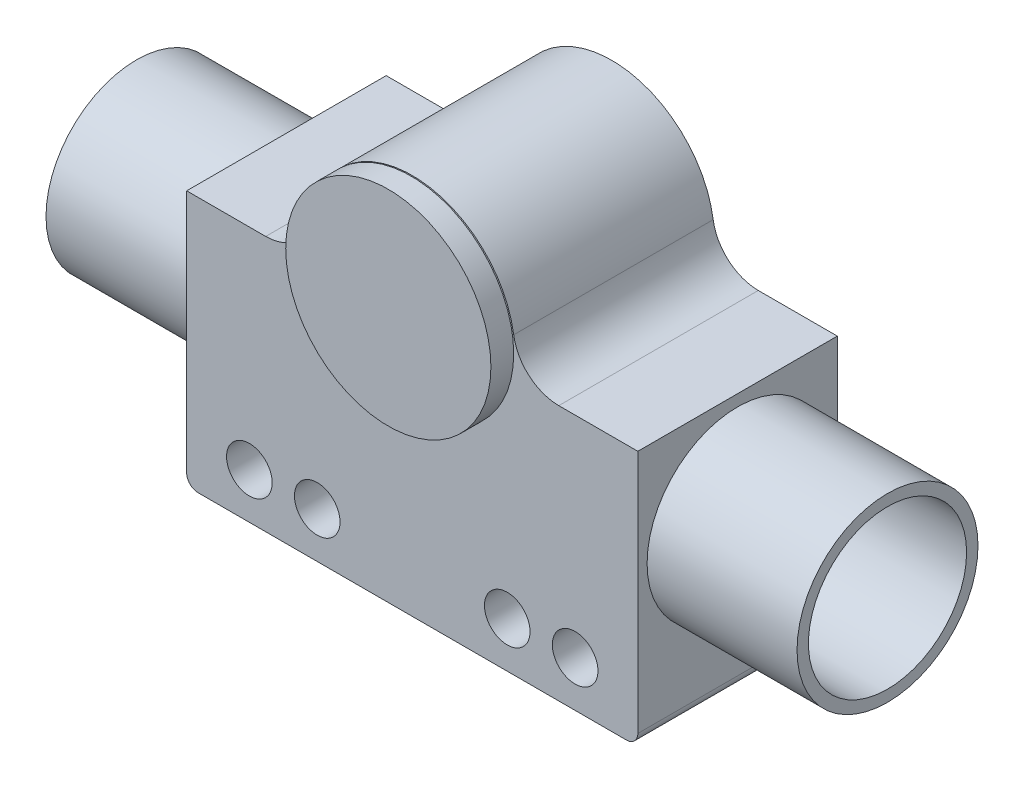
ISO-10303-21;
HEADER;
FILE_DESCRIPTION(('STEP AP214'),'2;1');
FILE_NAME('part.step','',(''),(''),'','','');
FILE_SCHEMA(('AUTOMOTIVE_DESIGN { 1 0 10303 214 1 1 1 1 }'));
ENDSEC;
DATA;
#1=APPLICATION_CONTEXT('core data for automotive mechanical design processes');
#2=APPLICATION_PROTOCOL_DEFINITION('international standard','automotive_design',2000,#1);
#3=PRODUCT_CONTEXT('',#1,'mechanical');
#4=PRODUCT('Part','Part','',(#3));
#5=PRODUCT_RELATED_PRODUCT_CATEGORY('part','',(#4));
#6=PRODUCT_DEFINITION_FORMATION('','',#4);
#7=PRODUCT_DEFINITION_CONTEXT('part definition',#1,'design');
#8=PRODUCT_DEFINITION('design','',#6,#7);
#9=PRODUCT_DEFINITION_SHAPE('','',#8);
#10=(LENGTH_UNIT() NAMED_UNIT(*) SI_UNIT(.MILLI.,.METRE.));
#11=(NAMED_UNIT(*) PLANE_ANGLE_UNIT() SI_UNIT($,.RADIAN.));
#12=(NAMED_UNIT(*) SI_UNIT($,.STERADIAN.) SOLID_ANGLE_UNIT());
#13=UNCERTAINTY_MEASURE_WITH_UNIT(LENGTH_MEASURE(1.E-05),#10,'distance_accuracy_value','');
#14=(GEOMETRIC_REPRESENTATION_CONTEXT(3) GLOBAL_UNCERTAINTY_ASSIGNED_CONTEXT((#13)) GLOBAL_UNIT_ASSIGNED_CONTEXT((#10,
#11,#12)) REPRESENTATION_CONTEXT('',''));
#15=CARTESIAN_POINT('',(0.,0.,0.));
#16=DIRECTION('',(0.,0.,1.));
#17=DIRECTION('',(1.,0.,0.));
#18=AXIS2_PLACEMENT_3D('',#15,#16,#17);
#19=CARTESIAN_POINT('',(-37.575,-27.,-17.5));
#20=DIRECTION('',(0.,0.,-1.));
#21=DIRECTION('',(-1.,0.,0.));
#22=AXIS2_PLACEMENT_3D('',#19,#20,#21);
#23=PLANE('',#22);
#24=CARTESIAN_POINT('',(0.,22.,-17.5));
#25=DIRECTION('',(0.,0.,-1.));
#26=DIRECTION('',(-1.,0.,0.));
#27=AXIS2_PLACEMENT_3D('',#24,#25,#26);
#28=CIRCLE('',#27,10.);
#29=CARTESIAN_POINT('',(-10.,22.,-17.5));
#30=VERTEX_POINT('',#29);
#31=EDGE_CURVE('E380',#30,#30,#28,.T.);
#32=ORIENTED_EDGE('',*,*,#31,.F.);
#33=EDGE_LOOP('',(#32));
#34=FACE_BOUND('',#33,.T.);
#35=CARTESIAN_POINT('',(-28.575,-19.,-17.5));
#36=DIRECTION('',(0.,0.,-1.));
#37=DIRECTION('',(-1.,0.,0.));
#38=AXIS2_PLACEMENT_3D('',#35,#36,#37);
#39=CIRCLE('',#38,4.);
#40=CARTESIAN_POINT('',(-32.575,-19.,-17.5));
#41=VERTEX_POINT('',#40);
#42=EDGE_CURVE('E12',#41,#41,#39,.T.);
#43=ORIENTED_EDGE('',*,*,#42,.F.);
#44=EDGE_LOOP('',(#43));
#45=FACE_BOUND('',#44,.T.);
#46=DIRECTION('',(1.,0.,0.));
#47=VECTOR('',#46,1.);
#48=CARTESIAN_POINT('',(0.,-27.,-17.5));
#49=LINE('',#48,#47);
#50=CARTESIAN_POINT('',(-37.575,-27.,-17.5));
#51=VERTEX_POINT('',#50);
#52=CARTESIAN_POINT('',(37.575,-27.,-17.5));
#53=VERTEX_POINT('',#52);
#54=EDGE_CURVE('E132',#51,#53,#49,.T.);
#55=ORIENTED_EDGE('',*,*,#54,.F.);
#56=CARTESIAN_POINT('',(-37.575,-25.,-17.5));
#57=DIRECTION('',(0.,0.,1.));
#58=DIRECTION('',(1.,0.,0.));
#59=AXIS2_PLACEMENT_3D('',#56,#57,#58);
#60=CIRCLE('',#59,2.);
#61=CARTESIAN_POINT('',(-39.575,-25.,-17.5));
#62=VERTEX_POINT('',#61);
#63=EDGE_CURVE('E128',#51,#62,#60,.F.);
#64=ORIENTED_EDGE('',*,*,#63,.T.);
#65=DIRECTION('',(0.,1.,0.));
#66=VECTOR('',#65,1.);
#67=CARTESIAN_POINT('',(-39.575,0.,-17.5));
#68=LINE('',#67,#66);
#69=CARTESIAN_POINT('',(-39.575,17.875,-17.5));
#70=VERTEX_POINT('',#69);
#71=EDGE_CURVE('E119',#62,#70,#68,.T.);
#72=ORIENTED_EDGE('',*,*,#71,.T.);
#73=DIRECTION('',(1.,0.,0.));
#74=VECTOR('',#73,1.);
#75=CARTESIAN_POINT('',(0.,17.875,-17.5));
#76=LINE('',#75,#74);
#77=CARTESIAN_POINT('',(-25.7096163915372,17.875,-17.5));
#78=VERTEX_POINT('',#77);
#79=EDGE_CURVE('E125',#70,#78,#76,.T.);
#80=ORIENTED_EDGE('',*,*,#79,.T.);
#81=CARTESIAN_POINT('',(-25.7096163915372,25.875,-17.5));
#82=DIRECTION('',(0.,0.,1.));
#83=DIRECTION('',(1.,0.,0.));
#84=AXIS2_PLACEMENT_3D('',#81,#82,#83);
#85=CIRCLE('',#84,8.);
#86=CARTESIAN_POINT('',(-17.7989651941412,24.6826923076923,-17.5));
#87=VERTEX_POINT('',#86);
#88=EDGE_CURVE('E146',#78,#87,#85,.T.);
#89=ORIENTED_EDGE('',*,*,#88,.T.);
#90=CARTESIAN_POINT('',(0.,22.,-17.5));
#91=DIRECTION('',(0.,0.,1.));
#92=DIRECTION('',(1.,0.,0.));
#93=AXIS2_PLACEMENT_3D('',#90,#91,#92);
#94=CIRCLE('',#93,18.);
#95=CARTESIAN_POINT('',(17.7989651941412,24.6826923076923,-17.5));
#96=VERTEX_POINT('',#95);
#97=EDGE_CURVE('E148',#96,#87,#94,.T.);
#98=ORIENTED_EDGE('',*,*,#97,.F.);
#99=CARTESIAN_POINT('',(25.7096163915372,25.875,-17.5));
#100=DIRECTION('',(0.,0.,1.));
#101=DIRECTION('',(1.,0.,0.));
#102=AXIS2_PLACEMENT_3D('',#99,#100,#101);
#103=CIRCLE('',#102,8.);
#104=CARTESIAN_POINT('',(25.7096163915372,17.875,-17.5));
#105=VERTEX_POINT('',#104);
#106=EDGE_CURVE('E105',#105,#96,#103,.F.);
#107=ORIENTED_EDGE('',*,*,#106,.F.);
#108=DIRECTION('',(-1.,0.,0.));
#109=VECTOR('',#108,1.);
#110=CARTESIAN_POINT('',(0.,17.875,-17.5));
#111=LINE('',#110,#109);
#112=CARTESIAN_POINT('',(39.575,17.875,-17.5));
#113=VERTEX_POINT('',#112);
#114=EDGE_CURVE('E300',#113,#105,#111,.T.);
#115=ORIENTED_EDGE('',*,*,#114,.F.);
#116=DIRECTION('',(0.,1.,0.));
#117=VECTOR('',#116,1.);
#118=CARTESIAN_POINT('',(39.575,0.,-17.5));
#119=LINE('',#118,#117);
#120=CARTESIAN_POINT('',(39.575,-25.,-17.5));
#121=VERTEX_POINT('',#120);
#122=EDGE_CURVE('E302',#121,#113,#119,.T.);
#123=ORIENTED_EDGE('',*,*,#122,.F.);
#124=CARTESIAN_POINT('',(37.575,-25.,-17.5));
#125=DIRECTION('',(0.,0.,1.));
#126=DIRECTION('',(1.,0.,0.));
#127=AXIS2_PLACEMENT_3D('',#124,#125,#126);
#128=CIRCLE('',#127,2.);
#129=EDGE_CURVE('E273',#121,#53,#128,.F.);
#130=ORIENTED_EDGE('',*,*,#129,.T.);
#131=EDGE_LOOP('',(#55,#64,#72,#80,#89,#98,#107,#115,#123,#130));
#132=FACE_BOUND('',#131,.T.);
#133=CARTESIAN_POINT('',(28.575,-19.,-17.5));
#134=DIRECTION('',(0.,0.,1.));
#135=DIRECTION('',(1.,0.,0.));
#136=AXIS2_PLACEMENT_3D('',#133,#134,#135);
#137=CIRCLE('',#136,4.00000000000002);
#138=CARTESIAN_POINT('',(32.575,-19.,-17.5));
#139=VERTEX_POINT('',#138);
#140=EDGE_CURVE('E175',#139,#139,#137,.T.);
#141=ORIENTED_EDGE('',*,*,#140,.T.);
#142=EDGE_LOOP('',(#141));
#143=FACE_BOUND('',#142,.T.);
#144=CARTESIAN_POINT('',(16.66875,-19.,-17.5));
#145=DIRECTION('',(0.,0.,1.));
#146=DIRECTION('',(1.,0.,0.));
#147=AXIS2_PLACEMENT_3D('',#144,#145,#146);
#148=CIRCLE('',#147,4.);
#149=CARTESIAN_POINT('',(20.66875,-19.,-17.5));
#150=VERTEX_POINT('',#149);
#151=EDGE_CURVE('E184',#150,#150,#148,.T.);
#152=ORIENTED_EDGE('',*,*,#151,.T.);
#153=EDGE_LOOP('',(#152));
#154=FACE_BOUND('',#153,.T.);
#155=CARTESIAN_POINT('',(-16.66875,-19.,-17.5));
#156=DIRECTION('',(0.,0.,-1.));
#157=DIRECTION('',(-1.,0.,0.));
#158=AXIS2_PLACEMENT_3D('',#155,#156,#157);
#159=CIRCLE('',#158,4.);
#160=CARTESIAN_POINT('',(-20.66875,-19.,-17.5));
#161=VERTEX_POINT('',#160);
#162=EDGE_CURVE('E190',#161,#161,#159,.T.);
#163=ORIENTED_EDGE('',*,*,#162,.F.);
#164=EDGE_LOOP('',(#163));
#165=FACE_BOUND('',#164,.T.);
#166=ADVANCED_FACE('F48',(#34,#45,#132,#143,#154,#165),#23,.T.);
#167=CARTESIAN_POINT('',(0.,0.,17.5));
#168=DIRECTION('',(0.,0.,1.));
#169=DIRECTION('',(1.,0.,0.));
#170=AXIS2_PLACEMENT_3D('',#167,#168,#169);
#171=PLANE('',#170);
#172=CARTESIAN_POINT('',(-16.66875,-19.,17.5));
#173=DIRECTION('',(0.,0.,-1.));
#174=DIRECTION('',(-1.,0.,0.));
#175=AXIS2_PLACEMENT_3D('',#172,#173,#174);
#176=CIRCLE('',#175,4.);
#177=CARTESIAN_POINT('',(-20.66875,-19.,17.5));
#178=VERTEX_POINT('',#177);
#179=EDGE_CURVE('E187',#178,#178,#176,.T.);
#180=ORIENTED_EDGE('',*,*,#179,.T.);
#181=EDGE_LOOP('',(#180));
#182=FACE_BOUND('',#181,.T.);
#183=CARTESIAN_POINT('',(16.66875,-19.,17.5));
#184=DIRECTION('',(0.,0.,1.));
#185=DIRECTION('',(1.,0.,0.));
#186=AXIS2_PLACEMENT_3D('',#183,#184,#185);
#187=CIRCLE('',#186,4.);
#188=CARTESIAN_POINT('',(20.66875,-19.,17.5));
#189=VERTEX_POINT('',#188);
#190=EDGE_CURVE('E181',#189,#189,#187,.T.);
#191=ORIENTED_EDGE('',*,*,#190,.F.);
#192=EDGE_LOOP('',(#191));
#193=FACE_BOUND('',#192,.T.);
#194=CARTESIAN_POINT('',(28.575,-19.,17.5));
#195=DIRECTION('',(0.,0.,1.));
#196=DIRECTION('',(1.,0.,0.));
#197=AXIS2_PLACEMENT_3D('',#194,#195,#196);
#198=CIRCLE('',#197,4.00000000000002);
#199=CARTESIAN_POINT('',(32.575,-19.,17.5));
#200=VERTEX_POINT('',#199);
#201=EDGE_CURVE('E178',#200,#200,#198,.T.);
#202=ORIENTED_EDGE('',*,*,#201,.F.);
#203=EDGE_LOOP('',(#202));
#204=FACE_BOUND('',#203,.T.);
#205=DIRECTION('',(0.,1.,0.));
#206=VECTOR('',#205,1.);
#207=CARTESIAN_POINT('',(-39.575,0.,17.5));
#208=LINE('',#207,#206);
#209=CARTESIAN_POINT('',(-39.575,-25.,17.5));
#210=VERTEX_POINT('',#209);
#211=CARTESIAN_POINT('',(-39.575,17.875,17.5));
#212=VERTEX_POINT('',#211);
#213=EDGE_CURVE('E139',#210,#212,#208,.T.);
#214=ORIENTED_EDGE('',*,*,#213,.F.);
#215=CARTESIAN_POINT('',(-37.575,-25.,17.5));
#216=DIRECTION('',(0.,0.,1.));
#217=DIRECTION('',(1.,0.,0.));
#218=AXIS2_PLACEMENT_3D('',#215,#216,#217);
#219=CIRCLE('',#218,2.);
#220=CARTESIAN_POINT('',(-37.575,-27.,17.5));
#221=VERTEX_POINT('',#220);
#222=EDGE_CURVE('E254',#210,#221,#219,.T.);
#223=ORIENTED_EDGE('',*,*,#222,.T.);
#224=DIRECTION('',(1.,0.,0.));
#225=VECTOR('',#224,1.);
#226=CARTESIAN_POINT('',(0.,-27.,17.5));
#227=LINE('',#226,#225);
#228=CARTESIAN_POINT('',(37.575,-27.,17.5));
#229=VERTEX_POINT('',#228);
#230=EDGE_CURVE('E161',#221,#229,#227,.T.);
#231=ORIENTED_EDGE('',*,*,#230,.T.);
#232=CARTESIAN_POINT('',(37.575,-25.,17.5));
#233=DIRECTION('',(0.,0.,1.));
#234=DIRECTION('',(1.,0.,0.));
#235=AXIS2_PLACEMENT_3D('',#232,#233,#234);
#236=CIRCLE('',#235,2.);
#237=CARTESIAN_POINT('',(39.575,-25.,17.5));
#238=VERTEX_POINT('',#237);
#239=EDGE_CURVE('E262',#229,#238,#236,.T.);
#240=ORIENTED_EDGE('',*,*,#239,.T.);
#241=DIRECTION('',(0.,1.,0.));
#242=VECTOR('',#241,1.);
#243=CARTESIAN_POINT('',(39.575,0.,17.5));
#244=LINE('',#243,#242);
#245=CARTESIAN_POINT('',(39.575,17.875,17.5));
#246=VERTEX_POINT('',#245);
#247=EDGE_CURVE('E159',#238,#246,#244,.T.);
#248=ORIENTED_EDGE('',*,*,#247,.T.);
#249=DIRECTION('',(-1.,0.,0.));
#250=VECTOR('',#249,1.);
#251=CARTESIAN_POINT('',(0.,17.875,17.5));
#252=LINE('',#251,#250);
#253=CARTESIAN_POINT('',(25.7096163915372,17.875,17.5));
#254=VERTEX_POINT('',#253);
#255=EDGE_CURVE('E156',#246,#254,#252,.T.);
#256=ORIENTED_EDGE('',*,*,#255,.T.);
#257=CARTESIAN_POINT('',(25.7096163915372,25.875,17.5));
#258=DIRECTION('',(0.,0.,1.));
#259=DIRECTION('',(1.,0.,0.));
#260=AXIS2_PLACEMENT_3D('',#257,#258,#259);
#261=CIRCLE('',#260,8.);
#262=CARTESIAN_POINT('',(17.7989651941412,24.6826923076923,17.5));
#263=VERTEX_POINT('',#262);
#264=EDGE_CURVE('E154',#254,#263,#261,.F.);
#265=ORIENTED_EDGE('',*,*,#264,.T.);
#266=CARTESIAN_POINT('',(0.,22.,17.5));
#267=DIRECTION('',(0.,0.,1.));
#268=DIRECTION('',(1.,0.,0.));
#269=AXIS2_PLACEMENT_3D('',#266,#267,#268);
#270=CIRCLE('',#269,18.);
#271=CARTESIAN_POINT('',(-17.7989651941412,24.6826923076923,17.5));
#272=VERTEX_POINT('',#271);
#273=EDGE_CURVE('E97',#263,#272,#270,.T.);
#274=ORIENTED_EDGE('',*,*,#273,.T.);
#275=CARTESIAN_POINT('',(-25.7096163915372,25.875,17.5));
#276=DIRECTION('',(0.,0.,1.));
#277=DIRECTION('',(1.,0.,0.));
#278=AXIS2_PLACEMENT_3D('',#275,#276,#277);
#279=CIRCLE('',#278,8.);
#280=CARTESIAN_POINT('',(-25.7096163915372,17.875,17.5));
#281=VERTEX_POINT('',#280);
#282=EDGE_CURVE('E167',#281,#272,#279,.T.);
#283=ORIENTED_EDGE('',*,*,#282,.F.);
#284=DIRECTION('',(1.,0.,0.));
#285=VECTOR('',#284,1.);
#286=CARTESIAN_POINT('',(0.,17.875,17.5));
#287=LINE('',#286,#285);
#288=EDGE_CURVE('E165',#212,#281,#287,.T.);
#289=ORIENTED_EDGE('',*,*,#288,.F.);
#290=EDGE_LOOP('',(#214,#223,#231,#240,#248,#256,#265,#274,#283,#289));
#291=FACE_BOUND('',#290,.T.);
#292=CARTESIAN_POINT('',(-28.575,-19.,17.5));
#293=DIRECTION('',(0.,0.,-1.));
#294=DIRECTION('',(-1.,0.,0.));
#295=AXIS2_PLACEMENT_3D('',#292,#293,#294);
#296=CIRCLE('',#295,4.);
#297=CARTESIAN_POINT('',(-32.575,-19.,17.5));
#298=VERTEX_POINT('',#297);
#299=EDGE_CURVE('E62',#298,#298,#296,.T.);
#300=ORIENTED_EDGE('',*,*,#299,.T.);
#301=EDGE_LOOP('',(#300));
#302=FACE_BOUND('',#301,.T.);
#303=ADVANCED_FACE('F196',(#182,#193,#204,#291,#302),#171,.T.);
#304=CARTESIAN_POINT('',(65.88125,0.,0.));
#305=DIRECTION('',(-1.,0.,0.));
#306=DIRECTION('',(0.,0.,1.));
#307=AXIS2_PLACEMENT_3D('',#304,#305,#306);
#308=CYLINDRICAL_SURFACE('',#307,15.875);
#309=CARTESIAN_POINT('',(-39.575,0.,0.));
#310=DIRECTION('',(-1.,0.,0.));
#311=DIRECTION('',(0.,0.,1.));
#312=AXIS2_PLACEMENT_3D('',#309,#310,#311);
#313=CIRCLE('',#312,15.875);
#314=CARTESIAN_POINT('',(-39.575,0.,15.875));
#315=VERTEX_POINT('',#314);
#316=EDGE_CURVE('E281',#315,#315,#313,.T.);
#317=ORIENTED_EDGE('',*,*,#316,.T.);
#318=EDGE_LOOP('',(#317));
#319=FACE_BOUND('',#318,.T.);
#320=CARTESIAN_POINT('',(-65.88125,0.,0.));
#321=DIRECTION('',(1.,0.,0.));
#322=DIRECTION('',(0.,0.,-1.));
#323=AXIS2_PLACEMENT_3D('',#320,#321,#322);
#324=CIRCLE('',#323,15.875);
#325=CARTESIAN_POINT('',(-65.88125,0.,-15.875));
#326=VERTEX_POINT('',#325);
#327=EDGE_CURVE('E284',#326,#326,#324,.T.);
#328=ORIENTED_EDGE('',*,*,#327,.T.);
#329=EDGE_LOOP('',(#328));
#330=FACE_BOUND('',#329,.T.);
#331=ADVANCED_FACE('F214',(#319,#330),#308,.T.);
#332=CARTESIAN_POINT('',(-65.88125,0.,0.));
#333=DIRECTION('',(1.,0.,0.));
#334=DIRECTION('',(0.,0.,-1.));
#335=AXIS2_PLACEMENT_3D('',#332,#333,#334);
#336=PLANE('',#335);
#337=CARTESIAN_POINT('',(-65.88125,0.,0.));
#338=DIRECTION('',(1.,0.,0.));
#339=DIRECTION('',(0.,0.,-1.));
#340=AXIS2_PLACEMENT_3D('',#337,#338,#339);
#341=CIRCLE('',#340,13.875);
#342=CARTESIAN_POINT('',(-65.88125,0.,-13.875));
#343=VERTEX_POINT('',#342);
#344=EDGE_CURVE('E153',#343,#343,#341,.T.);
#345=ORIENTED_EDGE('',*,*,#344,.T.);
#346=EDGE_LOOP('',(#345));
#347=FACE_BOUND('',#346,.T.);
#348=ORIENTED_EDGE('',*,*,#327,.F.);
#349=EDGE_LOOP('',(#348));
#350=FACE_BOUND('',#349,.T.);
#351=ADVANCED_FACE('F221',(#347,#350),#336,.F.);
#352=CARTESIAN_POINT('',(-39.575,0.,17.5));
#353=DIRECTION('',(-1.,0.,0.));
#354=DIRECTION('',(0.,0.,1.));
#355=AXIS2_PLACEMENT_3D('',#352,#353,#354);
#356=PLANE('',#355);
#357=ORIENTED_EDGE('',*,*,#71,.F.);
#358=DIRECTION('',(0.,0.,-1.));
#359=VECTOR('',#358,1.);
#360=CARTESIAN_POINT('',(-39.575,-25.,17.5));
#361=LINE('',#360,#359);
#362=EDGE_CURVE('E259',#62,#210,#361,.F.);
#363=ORIENTED_EDGE('',*,*,#362,.T.);
#364=ORIENTED_EDGE('',*,*,#213,.T.);
#365=DIRECTION('',(0.,0.,-1.));
#366=VECTOR('',#365,1.);
#367=CARTESIAN_POINT('',(-39.575,17.875,17.5));
#368=LINE('',#367,#366);
#369=EDGE_CURVE('E135',#212,#70,#368,.T.);
#370=ORIENTED_EDGE('',*,*,#369,.T.);
#371=EDGE_LOOP('',(#357,#363,#364,#370));
#372=FACE_BOUND('',#371,.T.);
#373=ORIENTED_EDGE('',*,*,#316,.F.);
#374=EDGE_LOOP('',(#373));
#375=FACE_BOUND('',#374,.T.);
#376=ADVANCED_FACE('F136',(#372,#375),#356,.T.);
#377=CARTESIAN_POINT('',(39.575,0.,17.5));
#378=DIRECTION('',(-1.,0.,0.));
#379=DIRECTION('',(0.,0.,1.));
#380=AXIS2_PLACEMENT_3D('',#377,#378,#379);
#381=PLANE('',#380);
#382=ORIENTED_EDGE('',*,*,#247,.F.);
#383=DIRECTION('',(0.,0.,-1.));
#384=VECTOR('',#383,1.);
#385=CARTESIAN_POINT('',(39.575,-25.,17.5));
#386=LINE('',#385,#384);
#387=EDGE_CURVE('E263',#238,#121,#386,.T.);
#388=ORIENTED_EDGE('',*,*,#387,.T.);
#389=ORIENTED_EDGE('',*,*,#122,.T.);
#390=DIRECTION('',(0.,0.,-1.));
#391=VECTOR('',#390,1.);
#392=CARTESIAN_POINT('',(39.575,17.875,17.5));
#393=LINE('',#392,#391);
#394=EDGE_CURVE('E143',#246,#113,#393,.T.);
#395=ORIENTED_EDGE('',*,*,#394,.F.);
#396=EDGE_LOOP('',(#382,#388,#389,#395));
#397=FACE_BOUND('',#396,.T.);
#398=CARTESIAN_POINT('',(39.575,0.,0.));
#399=DIRECTION('',(-1.,0.,0.));
#400=DIRECTION('',(0.,0.,1.));
#401=AXIS2_PLACEMENT_3D('',#398,#399,#400);
#402=CIRCLE('',#401,15.875);
#403=CARTESIAN_POINT('',(39.575,0.,15.875));
#404=VERTEX_POINT('',#403);
#405=EDGE_CURVE('E280',#404,#404,#402,.T.);
#406=ORIENTED_EDGE('',*,*,#405,.T.);
#407=EDGE_LOOP('',(#406));
#408=FACE_BOUND('',#407,.T.);
#409=ADVANCED_FACE('F319',(#397,#408),#381,.F.);
#410=CARTESIAN_POINT('',(0.,22.,17.5));
#411=DIRECTION('',(0.,0.,-1.));
#412=DIRECTION('',(-1.,0.,0.));
#413=AXIS2_PLACEMENT_3D('',#410,#411,#412);
#414=CYLINDRICAL_SURFACE('',#413,18.);
#415=ORIENTED_EDGE('',*,*,#97,.T.);
#416=DIRECTION('',(0.,0.,-1.));
#417=VECTOR('',#416,1.);
#418=CARTESIAN_POINT('',(-17.7989651941412,24.6826923076923,17.5));
#419=LINE('',#418,#417);
#420=EDGE_CURVE('E70',#272,#87,#419,.T.);
#421=ORIENTED_EDGE('',*,*,#420,.F.);
#422=ORIENTED_EDGE('',*,*,#273,.F.);
#423=DIRECTION('',(0.,0.,-1.));
#424=VECTOR('',#423,1.);
#425=CARTESIAN_POINT('',(17.7989651941412,24.6826923076923,17.5));
#426=LINE('',#425,#424);
#427=EDGE_CURVE('E157',#263,#96,#426,.T.);
#428=ORIENTED_EDGE('',*,*,#427,.T.);
#429=EDGE_LOOP('',(#415,#421,#422,#428));
#430=FACE_BOUND('',#429,.T.);
#431=ADVANCED_FACE('F330',(#430),#414,.T.);
#432=CARTESIAN_POINT('',(-25.7096163915372,25.875,17.5));
#433=DIRECTION('',(0.,0.,-1.));
#434=DIRECTION('',(-1.,0.,0.));
#435=AXIS2_PLACEMENT_3D('',#432,#433,#434);
#436=CYLINDRICAL_SURFACE('',#435,8.);
#437=ORIENTED_EDGE('',*,*,#88,.F.);
#438=DIRECTION('',(0.,0.,-1.));
#439=VECTOR('',#438,1.);
#440=CARTESIAN_POINT('',(-25.7096163915372,17.875,17.5));
#441=LINE('',#440,#439);
#442=EDGE_CURVE('E91',#281,#78,#441,.T.);
#443=ORIENTED_EDGE('',*,*,#442,.F.);
#444=ORIENTED_EDGE('',*,*,#282,.T.);
#445=ORIENTED_EDGE('',*,*,#420,.T.);
#446=EDGE_LOOP('',(#437,#443,#444,#445));
#447=FACE_BOUND('',#446,.T.);
#448=ADVANCED_FACE('F331',(#447),#436,.F.);
#449=CARTESIAN_POINT('',(0.,17.875,17.5));
#450=DIRECTION('',(0.,1.,0.));
#451=DIRECTION('',(-1.,0.,0.));
#452=AXIS2_PLACEMENT_3D('',#449,#450,#451);
#453=PLANE('',#452);
#454=ORIENTED_EDGE('',*,*,#79,.F.);
#455=ORIENTED_EDGE('',*,*,#369,.F.);
#456=ORIENTED_EDGE('',*,*,#288,.T.);
#457=ORIENTED_EDGE('',*,*,#442,.T.);
#458=EDGE_LOOP('',(#454,#455,#456,#457));
#459=FACE_BOUND('',#458,.T.);
#460=ADVANCED_FACE('F145',(#459),#453,.T.);
#461=CARTESIAN_POINT('',(0.,-27.,17.5));
#462=DIRECTION('',(0.,1.,0.));
#463=DIRECTION('',(-1.,0.,0.));
#464=AXIS2_PLACEMENT_3D('',#461,#462,#463);
#465=PLANE('',#464);
#466=ORIENTED_EDGE('',*,*,#230,.F.);
#467=DIRECTION('',(0.,0.,-1.));
#468=VECTOR('',#467,1.);
#469=CARTESIAN_POINT('',(-37.575,-27.,-17.5));
#470=LINE('',#469,#468);
#471=EDGE_CURVE('E261',#221,#51,#470,.T.);
#472=ORIENTED_EDGE('',*,*,#471,.T.);
#473=ORIENTED_EDGE('',*,*,#54,.T.);
#474=DIRECTION('',(0.,0.,-1.));
#475=VECTOR('',#474,1.);
#476=CARTESIAN_POINT('',(37.575,-27.,17.5));
#477=LINE('',#476,#475);
#478=EDGE_CURVE('E277',#53,#229,#477,.F.);
#479=ORIENTED_EDGE('',*,*,#478,.T.);
#480=EDGE_LOOP('',(#466,#472,#473,#479));
#481=FACE_BOUND('',#480,.T.);
#482=ADVANCED_FACE('F307',(#481),#465,.F.);
#483=CARTESIAN_POINT('',(0.,17.875,17.5));
#484=DIRECTION('',(0.,-1.,0.));
#485=DIRECTION('',(1.,0.,0.));
#486=AXIS2_PLACEMENT_3D('',#483,#484,#485);
#487=PLANE('',#486);
#488=ORIENTED_EDGE('',*,*,#114,.T.);
#489=DIRECTION('',(0.,0.,-1.));
#490=VECTOR('',#489,1.);
#491=CARTESIAN_POINT('',(25.7096163915372,17.875,17.5));
#492=LINE('',#491,#490);
#493=EDGE_CURVE('E296',#254,#105,#492,.T.);
#494=ORIENTED_EDGE('',*,*,#493,.F.);
#495=ORIENTED_EDGE('',*,*,#255,.F.);
#496=ORIENTED_EDGE('',*,*,#394,.T.);
#497=EDGE_LOOP('',(#488,#494,#495,#496));
#498=FACE_BOUND('',#497,.T.);
#499=ADVANCED_FACE('F326',(#498),#487,.F.);
#500=CARTESIAN_POINT('',(25.7096163915372,25.875,17.5));
#501=DIRECTION('',(0.,0.,-1.));
#502=DIRECTION('',(-1.,0.,0.));
#503=AXIS2_PLACEMENT_3D('',#500,#501,#502);
#504=CYLINDRICAL_SURFACE('',#503,8.);
#505=ORIENTED_EDGE('',*,*,#106,.T.);
#506=ORIENTED_EDGE('',*,*,#427,.F.);
#507=ORIENTED_EDGE('',*,*,#264,.F.);
#508=ORIENTED_EDGE('',*,*,#493,.T.);
#509=EDGE_LOOP('',(#505,#506,#507,#508));
#510=FACE_BOUND('',#509,.T.);
#511=ADVANCED_FACE('F230',(#510),#504,.F.);
#512=CARTESIAN_POINT('',(65.88125,0.,0.));
#513=DIRECTION('',(1.,0.,0.));
#514=DIRECTION('',(0.,0.,-1.));
#515=AXIS2_PLACEMENT_3D('',#512,#513,#514);
#516=PLANE('',#515);
#517=CARTESIAN_POINT('',(65.88125,0.,0.));
#518=DIRECTION('',(1.,0.,0.));
#519=DIRECTION('',(0.,0.,-1.));
#520=AXIS2_PLACEMENT_3D('',#517,#518,#519);
#521=CIRCLE('',#520,13.875);
#522=CARTESIAN_POINT('',(65.88125,0.,-13.875));
#523=VERTEX_POINT('',#522);
#524=EDGE_CURVE('E172',#523,#523,#521,.T.);
#525=ORIENTED_EDGE('',*,*,#524,.F.);
#526=EDGE_LOOP('',(#525));
#527=FACE_BOUND('',#526,.T.);
#528=CARTESIAN_POINT('',(65.88125,0.,0.));
#529=DIRECTION('',(1.,0.,0.));
#530=DIRECTION('',(0.,0.,-1.));
#531=AXIS2_PLACEMENT_3D('',#528,#529,#530);
#532=CIRCLE('',#531,15.875);
#533=CARTESIAN_POINT('',(65.88125,0.,-15.875));
#534=VERTEX_POINT('',#533);
#535=EDGE_CURVE('E287',#534,#534,#532,.T.);
#536=ORIENTED_EDGE('',*,*,#535,.T.);
#537=EDGE_LOOP('',(#536));
#538=FACE_BOUND('',#537,.T.);
#539=ADVANCED_FACE('F351',(#527,#538),#516,.T.);
#540=ORIENTED_EDGE('',*,*,#535,.F.);
#541=EDGE_LOOP('',(#540));
#542=FACE_BOUND('',#541,.T.);
#543=ORIENTED_EDGE('',*,*,#405,.F.);
#544=EDGE_LOOP('',(#543));
#545=FACE_BOUND('',#544,.T.);
#546=ADVANCED_FACE('F224',(#542,#545),#308,.T.);
#547=CARTESIAN_POINT('',(-65.88125,0.,0.));
#548=DIRECTION('',(1.,0.,0.));
#549=DIRECTION('',(0.,0.,-1.));
#550=AXIS2_PLACEMENT_3D('',#547,#548,#549);
#551=CYLINDRICAL_SURFACE('',#550,13.875);
#552=CARTESIAN_POINT('',(-5.82961190818052,13.875,0.));
#553=CARTESIAN_POINT('',(-5.82961246830566,13.8749988501596,0.20717744453501));
#554=CARTESIAN_POINT('',(-5.82314993958002,13.8703514822135,0.414399648910748));
#555=CARTESIAN_POINT('',(-5.79721309296048,13.8518365337998,0.827691985916031));
#556=CARTESIAN_POINT('',(-5.77773262877443,13.837964598057,1.03376152796279));
#557=CARTESIAN_POINT('',(-5.72545260124233,13.8012062783103,1.44388522901795));
#558=CARTESIAN_POINT('',(-5.69262289266842,13.7782994953756,1.64793374874098));
#559=CARTESIAN_POINT('',(-5.6132622162886,13.7239139287396,2.05216851681163));
#560=CARTESIAN_POINT('',(-5.56673306518701,13.6924362816756,2.2523552735254));
#561=CARTESIAN_POINT('',(-5.4592699054956,13.6214240044512,2.64820967265982));
#562=CARTESIAN_POINT('',(-5.39828250558886,13.5818595880033,2.8438575415311));
#563=CARTESIAN_POINT('',(-5.26141716389311,13.4956464186084,3.22830586711824));
#564=CARTESIAN_POINT('',(-5.18553790478589,13.4489970390158,3.41710571631367));
#565=CARTESIAN_POINT('',(-5.01845232243544,13.3498813847311,3.78585307310416));
#566=CARTESIAN_POINT('',(-4.92727012674081,13.2974243104368,3.96581394823262));
#567=CARTESIAN_POINT('',(-4.72904041144652,13.1881340256344,4.31535140664283));
#568=CARTESIAN_POINT('',(-4.62199714070564,13.1313019890427,4.48493075378507));
#569=CARTESIAN_POINT('',(-4.41601727192636,13.0273122090359,4.77739774568073));
#570=CARTESIAN_POINT('',(-4.32011910844941,12.9806369532,4.90259870392277));
#571=CARTESIAN_POINT('',(-4.11832063063926,12.8867202502415,5.1444073836144));
#572=CARTESIAN_POINT('',(-4.01241863218211,12.8394787089589,5.2610136522632));
#573=CARTESIAN_POINT('',(-3.67985675932101,12.6985854328167,5.59643511563725));
#574=CARTESIAN_POINT('',(-3.43810359311542,12.6056396301551,5.80119482106099));
#575=CARTESIAN_POINT('',(-3.04834621894012,12.4749469554039,6.07468158932655));
#576=CARTESIAN_POINT('',(-2.91342218533005,12.4327140597593,6.160458630317));
#577=CARTESIAN_POINT('',(-2.63541035659601,12.3524360197214,6.31987932906304));
#578=CARTESIAN_POINT('',(-2.49232614760703,12.3143890569524,6.39352826224983));
#579=CARTESIAN_POINT('',(-2.19901426567671,12.2436119427527,6.52804621224345));
#580=CARTESIAN_POINT('',(-2.04878633863921,12.2108819806266,6.58891477404536));
#581=CARTESIAN_POINT('',(-1.74240948413813,12.1517344299902,6.6973722029162));
#582=CARTESIAN_POINT('',(-1.58626114598388,12.125316215119,6.74496238777473));
#583=CARTESIAN_POINT('',(-1.28502085518586,12.0818571766953,6.82247207718337));
#584=CARTESIAN_POINT('',(-1.14035211272095,12.0641495746776,6.85366926207149));
#585=CARTESIAN_POINT('',(-0.848416565428534,12.0349760941321,6.90476967583419));
#586=CARTESIAN_POINT('',(-0.701149938043048,12.0235097909992,6.92467367300562));
#587=CARTESIAN_POINT('',(-0.405201995086663,12.0071140194219,6.95306458946688));
#588=CARTESIAN_POINT('',(-0.25652109077283,12.0021827058697,6.96155473138753));
#589=CARTESIAN_POINT('',(0.0411250402155679,11.9989772142281,6.96707845683531));
#590=CARTESIAN_POINT('',(0.190090261626709,12.0007029140728,6.96411225043102));
#591=CARTESIAN_POINT('',(0.480012728150531,12.0105249367488,6.94715791880178));
#592=CARTESIAN_POINT('',(0.621012093706979,12.0183124875643,6.93370396054059));
#593=CARTESIAN_POINT('',(0.901246150706789,12.039703412581,6.89649383093712));
#594=CARTESIAN_POINT('',(1.04048024915088,12.0533086904582,6.87273428736556));
#595=CARTESIAN_POINT('',(1.31609570459221,12.0860128272184,6.81505796225942));
#596=CARTESIAN_POINT('',(1.45247844767681,12.1051089470198,6.78114624474452));
#597=CARTESIAN_POINT('',(1.72159445393859,12.1483657581082,6.703343539095));
#598=CARTESIAN_POINT('',(1.85432634200356,12.1725283289319,6.65944884699358));
#599=CARTESIAN_POINT('',(2.11607731468668,12.225535658971,6.56163180866827));
#600=CARTESIAN_POINT('',(2.24506745830268,12.2544091860138,6.50764753464983));
#601=CARTESIAN_POINT('',(2.49769354271506,12.3160715684547,6.39018079032296));
#602=CARTESIAN_POINT('',(2.62132753106745,12.3488618355014,6.32669489339676));
#603=CARTESIAN_POINT('',(2.98306981894133,12.4520172198721,6.12258893149796));
#604=CARTESIAN_POINT('',(3.21224316533508,12.5272142945881,5.96823630527667));
#605=CARTESIAN_POINT('',(3.65463004866089,12.6885835883991,5.61736440654845));
#606=CARTESIAN_POINT('',(3.86616650166343,12.7751383508124,5.41892990526465));
#607=CARTESIAN_POINT('',(4.25561100395021,12.9481899003746,4.991299850279));
#608=CARTESIAN_POINT('',(4.43350514410419,13.0346866488755,4.76209164012303));
#609=CARTESIAN_POINT('',(4.68419987523426,13.1643622508793,4.3858491485052));
#610=CARTESIAN_POINT('',(4.7687296706082,13.2098095844903,4.24719914588599));
#611=CARTESIAN_POINT('',(4.92743632802057,13.2977816354635,3.96316672356532));
#612=CARTESIAN_POINT('',(5.00161249618101,13.3403061568482,3.81778385351018));
#613=CARTESIAN_POINT('',(5.13984970274096,13.4216329160818,3.52122950463247));
#614=CARTESIAN_POINT('',(5.20390678659588,13.4604336963768,3.37005579127914));
#615=CARTESIAN_POINT('',(5.32217943604084,13.533640605957,3.06286365178482));
#616=CARTESIAN_POINT('',(5.37639391681803,13.568046250704,2.90684469383662));
#617=CARTESIAN_POINT('',(5.48295904669933,13.6368788889099,2.56628702359023));
#618=CARTESIAN_POINT('',(5.53371401797796,13.6704801549102,2.38108066061985));
#619=CARTESIAN_POINT('',(5.62293629678193,13.7304489748877,2.00658190912524));
#620=CARTESIAN_POINT('',(5.6614025146078,13.7568158873328,1.81728915983061));
#621=CARTESIAN_POINT('',(5.72643857710462,13.8018619251934,1.43567521698702));
#622=CARTESIAN_POINT('',(5.75300256216307,13.8205372635896,1.2433525799109));
#623=CARTESIAN_POINT('',(5.79448748724056,13.8498738389819,0.856849652168742));
#624=CARTESIAN_POINT('',(5.80940784875997,13.8605346777861,0.662669269687944));
#625=CARTESIAN_POINT('',(5.8289340811965,13.8745029107011,0.2488102791127));
#626=CARTESIAN_POINT('',(5.83199300380704,13.8767070670564,0.0290191904445287));
#627=CARTESIAN_POINT('',(5.82358180241584,13.870675422648,-0.410155611859038));
#628=CARTESIAN_POINT('',(5.81211038075122,13.8624386894386,-0.629539287357138));
#629=CARTESIAN_POINT('',(5.77446011135086,13.8356784673284,-1.06657568094724));
#630=CARTESIAN_POINT('',(5.74827077091537,13.8171476396697,-1.28422705165016));
#631=CARTESIAN_POINT('',(5.68081983053462,13.7701777451455,-1.71610261564498));
#632=CARTESIAN_POINT('',(5.63955853018975,13.7417388752327,-1.93032687697259));
#633=CARTESIAN_POINT('',(5.54018076004982,13.6747321908103,-2.35915371944643));
#634=CARTESIAN_POINT('',(5.48165978189806,13.6359236794702,-2.57362555060233));
#635=CARTESIAN_POINT('',(5.34750911041662,13.549526041036,-2.99538006020275));
#636=CARTESIAN_POINT('',(5.27187762241576,13.5019359929689,-3.2026619818866));
#637=CARTESIAN_POINT('',(5.10290476592117,13.3994122931562,-3.60762145538958));
#638=CARTESIAN_POINT('',(5.00959073646929,13.3444900160279,-3.80531324960244));
#639=CARTESIAN_POINT('',(4.80454960476497,13.2290172392322,-4.1891355854491));
#640=CARTESIAN_POINT('',(4.69282948060139,13.1684688762959,-4.3752704718382));
#641=CARTESIAN_POINT('',(4.48260955117879,13.0604130305663,-4.68622772175658));
#642=CARTESIAN_POINT('',(4.38842465807533,13.0136904417084,-4.81424867052306));
#643=CARTESIAN_POINT('',(4.18989133747699,12.9194201000836,-5.06179697731812));
#644=CARTESIAN_POINT('',(4.08554149005277,12.8718722327993,-5.18132314467669));
#645=CARTESIAN_POINT('',(3.75737297922447,12.729687646839,-5.52557726853704));
#646=CARTESIAN_POINT('',(3.51817116317649,12.6353677351812,-5.73637746209649));
#647=CARTESIAN_POINT('',(3.13139349681101,12.5019347462092,-6.01899943546254));
#648=CARTESIAN_POINT('',(2.99730368045314,12.4586656911686,-6.10785330984724));
#649=CARTESIAN_POINT('',(2.72065334007049,12.3761323125928,-6.27339493737578));
#650=CARTESIAN_POINT('',(2.57809658603715,12.3368662275386,-6.35008805022375));
#651=CARTESIAN_POINT('',(2.28550961490196,12.2635117471936,-6.49062468320949));
#652=CARTESIAN_POINT('',(2.13547900179063,12.2294236266506,-6.554467521558));
#653=CARTESIAN_POINT('',(1.82916154136142,12.1674739309529,-6.66876542538905));
#654=CARTESIAN_POINT('',(1.67287534135172,12.1396117135156,-6.71922187195227));
#655=CARTESIAN_POINT('',(1.37148248234156,12.0934424895218,-6.80193228665011));
#656=CARTESIAN_POINT('',(1.22684164669307,12.0744544979646,-6.83551026648292));
#657=CARTESIAN_POINT('',(0.934716976529458,12.0426970059192,-6.89130667511523));
#658=CARTESIAN_POINT('',(0.787233346901749,12.0299270590098,-6.91352591941466));
#659=CARTESIAN_POINT('',(0.490613911528284,12.0109370282037,-6.94646520394747));
#660=CARTESIAN_POINT('',(0.341478599141262,12.0047150390528,-6.95718858913884));
#661=CARTESIAN_POINT('',(0.0426965635077783,11.9989750652557,-6.96708379323759));
#662=CARTESIAN_POINT('',(-0.106950149013136,11.9994569408623,-6.96625585294134));
#663=CARTESIAN_POINT('',(-0.397928123287067,12.0069151862372,-6.95339205508967));
#664=CARTESIAN_POINT('',(-0.539293788601728,12.0135586571268,-6.94193069048419));
#665=CARTESIAN_POINT('',(-0.820449207243498,12.0327174050551,-6.90866884688235));
#666=CARTESIAN_POINT('',(-0.960238430549327,12.0452345999937,-6.88686499080991));
#667=CARTESIAN_POINT('',(-1.23713989630768,12.0758436864684,-6.83305054467817));
#668=CARTESIAN_POINT('',(-1.37425347390082,12.0939327178954,-6.80104519091112));
#669=CARTESIAN_POINT('',(-1.64499565420707,12.1352773457318,-6.72699530634145));
#670=CARTESIAN_POINT('',(-1.77862294115308,12.1585348621491,-6.68494704432703));
#671=CARTESIAN_POINT('',(-2.04201289448982,12.2097881325417,-6.59087061181171));
#672=CARTESIAN_POINT('',(-2.17175779647151,12.2378026220867,-6.53880286663344));
#673=CARTESIAN_POINT('',(-2.42604715890125,12.2978661636674,-6.4251262152527));
#674=CARTESIAN_POINT('',(-2.55058974209767,12.3299166556251,-6.36351390202575));
#675=CARTESIAN_POINT('',(-2.91526285088834,12.4310564848256,-6.16494189674576));
#676=CARTESIAN_POINT('',(-3.14666251815913,12.5051795206993,-6.01416692984607));
#677=CARTESIAN_POINT('',(-3.59345114497412,12.6647633656798,-5.67071917958934));
#678=CARTESIAN_POINT('',(-3.80726274234263,12.7506232830136,-5.47620007238824));
#679=CARTESIAN_POINT('',(-4.20155526838971,12.9229249570949,-5.05619855044101));
#680=CARTESIAN_POINT('',(-4.38202641834047,13.0093668768629,-4.83070708522911));
#681=CARTESIAN_POINT('',(-4.7278506125796,13.1858416528833,-4.32758691302698));
#682=CARTESIAN_POINT('',(-4.88916147969039,13.2751681144612,-4.04694544297239));
#683=CARTESIAN_POINT('',(-5.17166609799442,13.4395853243326,-3.46201245666362));
#684=CARTESIAN_POINT('',(-5.29281712442851,13.5146608754976,-3.15769617565307));
#685=CARTESIAN_POINT('',(-5.45398803818456,13.6179460531824,-2.66484430603989));
#686=CARTESIAN_POINT('',(-5.5066725655947,13.6525651882159,-2.48162736531611));
#687=CARTESIAN_POINT('',(-5.59984274248005,13.714776644115,-2.11087750768695));
#688=CARTESIAN_POINT('',(-5.64032587506929,13.7423675150192,-1.92334370888204));
#689=CARTESIAN_POINT('',(-5.70940051144738,13.7899759718854,-1.54545465955482));
#690=CARTESIAN_POINT('',(-5.73800890888882,13.8100043130275,-1.35510381904451));
#691=CARTESIAN_POINT('',(-5.78370859067062,13.8422121719105,-0.972432107688732));
#692=CARTESIAN_POINT('',(-5.80080468820389,13.854394969712,-0.780112094322916));
#693=CARTESIAN_POINT('',(-5.81803643914842,13.8667046539332,-0.489598497294811));
#694=CARTESIAN_POINT('',(-5.8223784136551,13.8698140926427,-0.391754616243428));
#695=CARTESIAN_POINT('',(-5.82816592959654,13.8739619759795,-0.195943821816399));
#696=CARTESIAN_POINT('',(-5.82961164329003,13.8750005437745,-0.0979769161046075));
#697=CARTESIAN_POINT('',(-5.82961190818052,13.875,0.));
#698=B_SPLINE_CURVE_WITH_KNOTS('',3,(#552,#553,#554,#555,#556,#557,#558,#559,#560,#561,#562,
#563,#564,#565,#566,#567,#568,#569,#570,#571,#572,#573,#574,#575,#576,#577,#578,#579,#580,#581,
#582,#583,#584,#585,#586,#587,#588,#589,#590,#591,#592,#593,#594,#595,#596,#597,#598,#599,#600,
#601,#602,#603,#604,#605,#606,#607,#608,#609,#610,#611,#612,#613,#614,#615,#616,#617,#618,#619,
#620,#621,#622,#623,#624,#625,#626,#627,#628,#629,#630,#631,#632,#633,#634,#635,#636,#637,#638,
#639,#640,#641,#642,#643,#644,#645,#646,#647,#648,#649,#650,#651,#652,#653,#654,#655,#656,#657,
#658,#659,#660,#661,#662,#663,#664,#665,#666,#667,#668,#669,#670,#671,#672,#673,#674,#675,#676,
#677,#678,#679,#680,#681,#682,#683,#684,#685,#686,#687,#688,#689,#690,#691,#692,#693,#694,#695,
#696,#697),.UNSPECIFIED.,.T.,.F.,(4,2,2,2,2,2,2,2,2,2,2,2,2,2,2,2,2,2,2,2,2,2,2,2,2,2,2,2,2,2,2,
2,2,2,2,2,2,2,2,2,2,2,2,2,2,2,2,2,2,2,2,2,2,2,2,2,2,2,2,2,2,2,2,2,2,2,2,2,2,2,2,2,4),(0.,
0.621456374295161,1.24320637069858,1.86636826843863,2.48944756490521,3.11486462412493,
3.74033703203613,4.36483239012358,4.9891607600607,5.48203802649562,5.97499841612914,
6.95962981587101,7.4551803867364,7.95051483254133,8.44586691018195,8.94116980996042,
9.38775397198918,9.83430774841168,10.2807354166633,10.7271548990626,11.1522141310189,
11.5774125573839,12.0023992423375,12.4275438673966,12.855389154522,13.2833891110931,
14.1386635837214,15.0431505000567,15.9480105552268,16.4534781248661,16.9589795536149,
17.4646780465168,17.9704322417181,18.5546942270894,19.1390080072482,19.7236091368879,
20.308239309893,20.9669664893303,21.6257525019291,22.285008773196,22.9442519404813,
23.6203742828396,24.2965675745926,24.9717238077243,25.646624663254,26.1430772359712,
26.6395992572258,27.6311681315396,28.1303405108715,28.6292922709863,29.1282704967091,
29.6271972225643,30.0757156786406,30.5242019288292,30.9725576472181,31.4209040192969,
31.8463555168013,32.2719460303409,32.697318444795,33.1228491431032,33.5500964315631,
33.9774965829364,34.8315793073998,35.7325704187345,36.6338253719788,37.6373952210753,
38.6420293346102,39.2228201244172,39.8037306370355,40.3838118581033,40.963650401406,
41.2575627088925,41.5514575350578),.UNSPECIFIED.);
#699=CARTESIAN_POINT('',(-5.82961190818052,13.875,0.));
#700=VERTEX_POINT('',#699);
#701=EDGE_CURVE('E51',#700,#700,#698,.T.);
#702=ORIENTED_EDGE('',*,*,#701,.T.);
#703=EDGE_LOOP('',(#702));
#704=FACE_BOUND('',#703,.T.);
#705=ORIENTED_EDGE('',*,*,#344,.F.);
#706=EDGE_LOOP('',(#705));
#707=FACE_BOUND('',#706,.T.);
#708=ORIENTED_EDGE('',*,*,#524,.T.);
#709=EDGE_LOOP('',(#708));
#710=FACE_BOUND('',#709,.T.);
#711=ADVANCED_FACE('F232',(#704,#707,#710),#551,.F.);
#712=CARTESIAN_POINT('',(28.575,-19.,-17.5));
#713=DIRECTION('',(0.,0.,1.));
#714=DIRECTION('',(1.,0.,0.));
#715=AXIS2_PLACEMENT_3D('',#712,#713,#714);
#716=CYLINDRICAL_SURFACE('',#715,4.00000000000002);
#717=ORIENTED_EDGE('',*,*,#140,.F.);
#718=EDGE_LOOP('',(#717));
#719=FACE_BOUND('',#718,.T.);
#720=ORIENTED_EDGE('',*,*,#201,.T.);
#721=EDGE_LOOP('',(#720));
#722=FACE_BOUND('',#721,.T.);
#723=ADVANCED_FACE('F236',(#719,#722),#716,.F.);
#724=CARTESIAN_POINT('',(16.66875,-19.,-17.5));
#725=DIRECTION('',(0.,0.,1.));
#726=DIRECTION('',(1.,0.,0.));
#727=AXIS2_PLACEMENT_3D('',#724,#725,#726);
#728=CYLINDRICAL_SURFACE('',#727,4.);
#729=ORIENTED_EDGE('',*,*,#151,.F.);
#730=EDGE_LOOP('',(#729));
#731=FACE_BOUND('',#730,.T.);
#732=ORIENTED_EDGE('',*,*,#190,.T.);
#733=EDGE_LOOP('',(#732));
#734=FACE_BOUND('',#733,.T.);
#735=ADVANCED_FACE('F210',(#731,#734),#728,.F.);
#736=CARTESIAN_POINT('',(-16.66875,-19.,-17.5));
#737=DIRECTION('',(0.,0.,1.));
#738=DIRECTION('',(1.,0.,0.));
#739=AXIS2_PLACEMENT_3D('',#736,#737,#738);
#740=CYLINDRICAL_SURFACE('',#739,4.);
#741=ORIENTED_EDGE('',*,*,#162,.T.);
#742=EDGE_LOOP('',(#741));
#743=FACE_BOUND('',#742,.T.);
#744=ORIENTED_EDGE('',*,*,#179,.F.);
#745=EDGE_LOOP('',(#744));
#746=FACE_BOUND('',#745,.T.);
#747=ADVANCED_FACE('F201',(#743,#746),#740,.F.);
#748=CARTESIAN_POINT('',(-28.575,-19.,-17.5));
#749=DIRECTION('',(0.,0.,1.));
#750=DIRECTION('',(1.,0.,0.));
#751=AXIS2_PLACEMENT_3D('',#748,#749,#750);
#752=CYLINDRICAL_SURFACE('',#751,4.);
#753=ORIENTED_EDGE('',*,*,#42,.T.);
#754=EDGE_LOOP('',(#753));
#755=FACE_BOUND('',#754,.T.);
#756=ORIENTED_EDGE('',*,*,#299,.F.);
#757=EDGE_LOOP('',(#756));
#758=FACE_BOUND('',#757,.T.);
#759=ADVANCED_FACE('F198',(#755,#758),#752,.F.);
#760=CARTESIAN_POINT('',(-37.575,-25.,17.5));
#761=DIRECTION('',(0.,0.,1.));
#762=DIRECTION('',(1.,0.,0.));
#763=AXIS2_PLACEMENT_3D('',#760,#761,#762);
#764=CYLINDRICAL_SURFACE('',#763,2.);
#765=ORIENTED_EDGE('',*,*,#222,.F.);
#766=ORIENTED_EDGE('',*,*,#362,.F.);
#767=ORIENTED_EDGE('',*,*,#63,.F.);
#768=ORIENTED_EDGE('',*,*,#471,.F.);
#769=EDGE_LOOP('',(#765,#766,#767,#768));
#770=FACE_BOUND('',#769,.T.);
#771=ADVANCED_FACE('F200',(#770),#764,.T.);
#772=CARTESIAN_POINT('',(37.575,-25.,17.5));
#773=DIRECTION('',(0.,0.,-1.));
#774=DIRECTION('',(-1.,0.,0.));
#775=AXIS2_PLACEMENT_3D('',#772,#773,#774);
#776=CYLINDRICAL_SURFACE('',#775,2.);
#777=ORIENTED_EDGE('',*,*,#239,.F.);
#778=ORIENTED_EDGE('',*,*,#478,.F.);
#779=ORIENTED_EDGE('',*,*,#129,.F.);
#780=ORIENTED_EDGE('',*,*,#387,.F.);
#781=EDGE_LOOP('',(#777,#778,#779,#780));
#782=FACE_BOUND('',#781,.T.);
#783=ADVANCED_FACE('F207',(#782),#776,.T.);
#784=CARTESIAN_POINT('',(0.,22.,16.5));
#785=DIRECTION('',(0.,0.,-1.));
#786=DIRECTION('',(-1.,0.,0.));
#787=AXIS2_PLACEMENT_3D('',#784,#785,#786);
#788=CYLINDRICAL_SURFACE('',#787,10.);
#789=ORIENTED_EDGE('',*,*,#31,.T.);
#790=EDGE_LOOP('',(#789));
#791=FACE_BOUND('',#790,.T.);
#792=CARTESIAN_POINT('',(0.,22.,16.5));
#793=DIRECTION('',(0.,0.,-1.));
#794=DIRECTION('',(-1.,0.,0.));
#795=AXIS2_PLACEMENT_3D('',#792,#793,#794);
#796=CIRCLE('',#795,10.);
#797=CARTESIAN_POINT('',(-10.,22.,16.5));
#798=VERTEX_POINT('',#797);
#799=EDGE_CURVE('E378',#798,#798,#796,.T.);
#800=ORIENTED_EDGE('',*,*,#799,.F.);
#801=EDGE_LOOP('',(#800));
#802=FACE_BOUND('',#801,.T.);
#803=ORIENTED_EDGE('',*,*,#701,.F.);
#804=EDGE_LOOP('',(#803));
#805=FACE_BOUND('',#804,.T.);
#806=ADVANCED_FACE('F227',(#791,#802,#805),#788,.F.);
#807=CARTESIAN_POINT('',(0.,22.,16.5));
#808=DIRECTION('',(0.,0.,-1.));
#809=DIRECTION('',(-1.,0.,0.));
#810=AXIS2_PLACEMENT_3D('',#807,#808,#809);
#811=PLANE('',#810);
#812=ORIENTED_EDGE('',*,*,#799,.T.);
#813=EDGE_LOOP('',(#812));
#814=FACE_BOUND('',#813,.T.);
#815=ADVANCED_FACE('F370',(#814),#811,.T.);
#816=CLOSED_SHELL('',(#166,#303,#331,#351,#376,#409,#431,#448,#460,#482,#499,#511,#539,#546,
#711,#723,#735,#747,#759,#771,#783,#806,#815));
#817=MANIFOLD_SOLID_BREP('B2',#816);
#818=CARTESIAN_POINT('',(0.,22.,21.7));
#819=DIRECTION('',(0.,0.,-1.));
#820=DIRECTION('',(-1.,0.,0.));
#821=AXIS2_PLACEMENT_3D('',#818,#819,#820);
#822=CYLINDRICAL_SURFACE('',#821,18.);
#823=CARTESIAN_POINT('',(0.,22.,21.7));
#824=DIRECTION('',(0.,0.,1.));
#825=DIRECTION('',(1.,0.,0.));
#826=AXIS2_PLACEMENT_3D('',#823,#824,#825);
#827=CIRCLE('',#826,18.);
#828=CARTESIAN_POINT('',(18.,22.,21.7));
#829=VERTEX_POINT('',#828);
#830=EDGE_CURVE('E47',#829,#829,#827,.T.);
#831=ORIENTED_EDGE('',*,*,#830,.F.);
#832=EDGE_LOOP('',(#831));
#833=FACE_BOUND('',#832,.T.);
#834=CARTESIAN_POINT('',(0.,22.,17.7));
#835=DIRECTION('',(0.,0.,1.));
#836=DIRECTION('',(1.,0.,0.));
#837=AXIS2_PLACEMENT_3D('',#834,#835,#836);
#838=CIRCLE('',#837,18.);
#839=CARTESIAN_POINT('',(18.,22.,17.7));
#840=VERTEX_POINT('',#839);
#841=EDGE_CURVE('E597',#840,#840,#838,.T.);
#842=ORIENTED_EDGE('',*,*,#841,.T.);
#843=EDGE_LOOP('',(#842));
#844=FACE_BOUND('',#843,.T.);
#845=ADVANCED_FACE('F594',(#833,#844),#822,.T.);
#846=CARTESIAN_POINT('',(0.,22.,21.7));
#847=DIRECTION('',(0.,0.,1.));
#848=DIRECTION('',(1.,0.,0.));
#849=AXIS2_PLACEMENT_3D('',#846,#847,#848);
#850=PLANE('',#849);
#851=ORIENTED_EDGE('',*,*,#830,.T.);
#852=EDGE_LOOP('',(#851));
#853=FACE_BOUND('',#852,.T.);
#854=ADVANCED_FACE('F609',(#853),#850,.T.);
#855=CARTESIAN_POINT('',(0.,22.,17.7));
#856=DIRECTION('',(0.,0.,1.));
#857=DIRECTION('',(1.,0.,0.));
#858=AXIS2_PLACEMENT_3D('',#855,#856,#857);
#859=PLANE('',#858);
#860=ORIENTED_EDGE('',*,*,#841,.F.);
#861=EDGE_LOOP('',(#860));
#862=FACE_BOUND('',#861,.T.);
#863=ADVANCED_FACE('F607',(#862),#859,.F.);
#864=CLOSED_SHELL('',(#845,#854,#863));
#865=MANIFOLD_SOLID_BREP('B6',#864);
#866=ADVANCED_BREP_SHAPE_REPRESENTATION('',(#18,#817,#865),#14);
#867=SHAPE_DEFINITION_REPRESENTATION(#9,#866);
ENDSEC;
END-ISO-10303-21;
